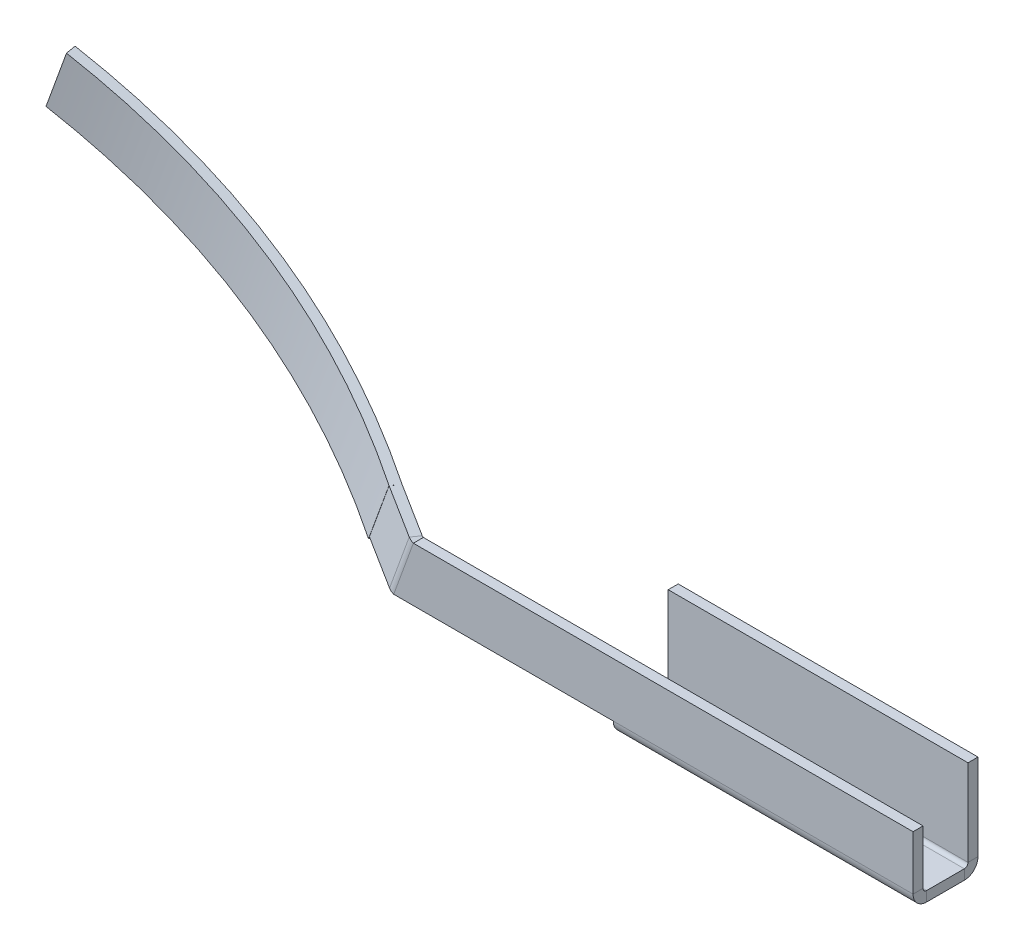
ISO-10303-21;
HEADER;
FILE_DESCRIPTION(('STEP AP214'),'2;1');
FILE_NAME('part.step','',(''),(''),'','','');
FILE_SCHEMA(('AUTOMOTIVE_DESIGN { 1 0 10303 214 1 1 1 1 }'));
ENDSEC;
DATA;
#1=APPLICATION_CONTEXT('core data for automotive mechanical design processes');
#2=APPLICATION_PROTOCOL_DEFINITION('international standard','automotive_design',2000,#1);
#3=PRODUCT_CONTEXT('',#1,'mechanical');
#4=PRODUCT('Part','Part','',(#3));
#5=PRODUCT_RELATED_PRODUCT_CATEGORY('part','',(#4));
#6=PRODUCT_DEFINITION_FORMATION('','',#4);
#7=PRODUCT_DEFINITION_CONTEXT('part definition',#1,'design');
#8=PRODUCT_DEFINITION('design','',#6,#7);
#9=PRODUCT_DEFINITION_SHAPE('','',#8);
#10=(LENGTH_UNIT() NAMED_UNIT(*) SI_UNIT(.MILLI.,.METRE.));
#11=(NAMED_UNIT(*) PLANE_ANGLE_UNIT() SI_UNIT($,.RADIAN.));
#12=(NAMED_UNIT(*) SI_UNIT($,.STERADIAN.) SOLID_ANGLE_UNIT());
#13=UNCERTAINTY_MEASURE_WITH_UNIT(LENGTH_MEASURE(1.E-05),#10,'distance_accuracy_value','');
#14=(GEOMETRIC_REPRESENTATION_CONTEXT(3) GLOBAL_UNCERTAINTY_ASSIGNED_CONTEXT((#13)) GLOBAL_UNIT_ASSIGNED_CONTEXT((#10,
#11,#12)) REPRESENTATION_CONTEXT('',''));
#15=CARTESIAN_POINT('',(0.,0.,0.));
#16=DIRECTION('',(0.,0.,1.));
#17=DIRECTION('',(1.,0.,0.));
#18=AXIS2_PLACEMENT_3D('',#15,#16,#17);
#19=CARTESIAN_POINT('',(30.,-10.,0.));
#20=DIRECTION('',(1.,0.,0.));
#21=DIRECTION('',(0.,0.,-1.));
#22=AXIS2_PLACEMENT_3D('',#19,#20,#21);
#23=PLANE('',#22);
#24=DIRECTION('',(0.,0.,1.));
#25=VECTOR('',#24,1.);
#26=CARTESIAN_POINT('',(30.,-8.,0.));
#27=LINE('',#26,#25);
#28=CARTESIAN_POINT('',(30.,-8.00000000000002,8.26340000000001));
#29=VERTEX_POINT('',#28);
#30=CARTESIAN_POINT('',(30.,-8.,0.736599999999997));
#31=VERTEX_POINT('',#30);
#32=EDGE_CURVE('E609',#29,#31,#27,.F.);
#33=ORIENTED_EDGE('',*,*,#32,.F.);
#34=DIRECTION('',(0.,-1.,0.));
#35=VECTOR('',#34,1.);
#36=CARTESIAN_POINT('',(30.,-8.00000000000002,8.26340000000001));
#37=LINE('',#36,#35);
#38=CARTESIAN_POINT('',(30.,-10.,8.26340000000017));
#39=VERTEX_POINT('',#38);
#40=EDGE_CURVE('E572',#29,#39,#37,.T.);
#41=ORIENTED_EDGE('',*,*,#40,.T.);
#42=DIRECTION('',(0.,0.,-1.));
#43=VECTOR('',#42,1.);
#44=CARTESIAN_POINT('',(30.,-10.,0.));
#45=LINE('',#44,#43);
#46=CARTESIAN_POINT('',(30.,-10.,0.73659999999999));
#47=VERTEX_POINT('',#46);
#48=EDGE_CURVE('E601',#39,#47,#45,.T.);
#49=ORIENTED_EDGE('',*,*,#48,.T.);
#50=DIRECTION('',(0.,-1.,0.));
#51=VECTOR('',#50,1.);
#52=CARTESIAN_POINT('',(30.,-8.,0.736599999999997));
#53=LINE('',#52,#51);
#54=EDGE_CURVE('E620',#31,#47,#53,.T.);
#55=ORIENTED_EDGE('',*,*,#54,.F.);
#56=EDGE_LOOP('',(#33,#41,#49,#55));
#57=FACE_BOUND('',#56,.T.);
#58=ADVANCED_FACE('F101',(#57),#23,.T.);
#59=CARTESIAN_POINT('',(0.,-10.,0.));
#60=DIRECTION('',(0.,-1.,0.));
#61=DIRECTION('',(0.,0.,-1.));
#62=AXIS2_PLACEMENT_3D('',#59,#60,#61);
#63=PLANE('',#62);
#64=ORIENTED_EDGE('',*,*,#48,.F.);
#65=DIRECTION('',(1.,0.,0.));
#66=VECTOR('',#65,1.);
#67=CARTESIAN_POINT('',(30.,-10.,8.26340000000017));
#68=LINE('',#67,#66);
#69=CARTESIAN_POINT('',(-30.,-10.,8.26340000000007));
#70=VERTEX_POINT('',#69);
#71=EDGE_CURVE('E564',#39,#70,#68,.F.);
#72=ORIENTED_EDGE('',*,*,#71,.T.);
#73=DIRECTION('',(0.,0.,1.));
#74=VECTOR('',#73,1.);
#75=CARTESIAN_POINT('',(-30.,-10.,11.));
#76=LINE('',#75,#74);
#77=CARTESIAN_POINT('',(-30.,-10.,0.73659999999999));
#78=VERTEX_POINT('',#77);
#79=EDGE_CURVE('E605',#78,#70,#76,.T.);
#80=ORIENTED_EDGE('',*,*,#79,.F.);
#81=DIRECTION('',(1.,0.,0.));
#82=VECTOR('',#81,1.);
#83=CARTESIAN_POINT('',(0.,-10.,0.73659999999999));
#84=LINE('',#83,#82);
#85=EDGE_CURVE('E616',#78,#47,#84,.T.);
#86=ORIENTED_EDGE('',*,*,#85,.T.);
#87=EDGE_LOOP('',(#64,#72,#80,#86));
#88=FACE_BOUND('',#87,.T.);
#89=ADVANCED_FACE('F370',(#88),#63,.T.);
#90=CARTESIAN_POINT('',(0.,-8.,0.));
#91=DIRECTION('',(0.,-1.,0.));
#92=DIRECTION('',(0.,0.,-1.));
#93=AXIS2_PLACEMENT_3D('',#90,#91,#92);
#94=PLANE('',#93);
#95=DIRECTION('',(1.,0.,0.));
#96=VECTOR('',#95,1.);
#97=CARTESIAN_POINT('',(30.,-8.00000000000002,8.26340000000001));
#98=LINE('',#97,#96);
#99=CARTESIAN_POINT('',(-30.,-8.00000000000002,8.26340000000008));
#100=VERTEX_POINT('',#99);
#101=EDGE_CURVE('E580',#29,#100,#98,.F.);
#102=ORIENTED_EDGE('',*,*,#101,.F.);
#103=ORIENTED_EDGE('',*,*,#32,.T.);
#104=DIRECTION('',(-1.,0.,0.));
#105=VECTOR('',#104,1.);
#106=CARTESIAN_POINT('',(-30.,-8.,0.736599999999997));
#107=LINE('',#106,#105);
#108=CARTESIAN_POINT('',(-30.,-8.,0.736599999999997));
#109=VERTEX_POINT('',#108);
#110=EDGE_CURVE('E624',#109,#31,#107,.F.);
#111=ORIENTED_EDGE('',*,*,#110,.F.);
#112=DIRECTION('',(0.,0.,-1.));
#113=VECTOR('',#112,1.);
#114=CARTESIAN_POINT('',(-30.,-8.,0.));
#115=LINE('',#114,#113);
#116=EDGE_CURVE('E612',#109,#100,#115,.F.);
#117=ORIENTED_EDGE('',*,*,#116,.T.);
#118=EDGE_LOOP('',(#102,#103,#111,#117));
#119=FACE_BOUND('',#118,.T.);
#120=ADVANCED_FACE('F373',(#119),#94,.F.);
#121=CARTESIAN_POINT('',(30.,10.,-2.));
#122=DIRECTION('',(1.,0.,0.));
#123=DIRECTION('',(0.,1.,0.));
#124=AXIS2_PLACEMENT_3D('',#121,#122,#123);
#125=PLANE('',#124);
#126=DIRECTION('',(0.,1.,0.));
#127=VECTOR('',#126,1.);
#128=CARTESIAN_POINT('',(30.,10.,0.));
#129=LINE('',#128,#127);
#130=CARTESIAN_POINT('',(30.,-7.2634,0.));
#131=VERTEX_POINT('',#130);
#132=CARTESIAN_POINT('',(30.,10.,0.));
#133=VERTEX_POINT('',#132);
#134=EDGE_CURVE('E429',#131,#133,#129,.T.);
#135=ORIENTED_EDGE('',*,*,#134,.F.);
#136=DIRECTION('',(0.,0.,-1.));
#137=VECTOR('',#136,1.);
#138=CARTESIAN_POINT('',(30.,-7.2634,0.));
#139=LINE('',#138,#137);
#140=CARTESIAN_POINT('',(30.,-7.2634,-2.));
#141=VERTEX_POINT('',#140);
#142=EDGE_CURVE('E639',#131,#141,#139,.T.);
#143=ORIENTED_EDGE('',*,*,#142,.T.);
#144=DIRECTION('',(0.,1.,0.));
#145=VECTOR('',#144,1.);
#146=CARTESIAN_POINT('',(30.,10.,-2.));
#147=LINE('',#146,#145);
#148=CARTESIAN_POINT('',(30.,10.,-2.));
#149=VERTEX_POINT('',#148);
#150=EDGE_CURVE('E433',#141,#149,#147,.T.);
#151=ORIENTED_EDGE('',*,*,#150,.T.);
#152=DIRECTION('',(0.,0.,1.));
#153=VECTOR('',#152,1.);
#154=CARTESIAN_POINT('',(30.,10.,-2.));
#155=LINE('',#154,#153);
#156=EDGE_CURVE('E422',#149,#133,#155,.T.);
#157=ORIENTED_EDGE('',*,*,#156,.T.);
#158=EDGE_LOOP('',(#135,#143,#151,#157));
#159=FACE_BOUND('',#158,.T.);
#160=ADVANCED_FACE('F103',(#159),#125,.T.);
#161=CARTESIAN_POINT('',(0.,0.,-2.));
#162=DIRECTION('',(0.,0.,1.));
#163=DIRECTION('',(1.,0.,0.));
#164=AXIS2_PLACEMENT_3D('',#161,#162,#163);
#165=PLANE('',#164);
#166=DIRECTION('',(1.,0.,0.));
#167=VECTOR('',#166,1.);
#168=CARTESIAN_POINT('',(30.,-7.2634,-2.));
#169=LINE('',#168,#167);
#170=CARTESIAN_POINT('',(-30.,-7.26339999999999,-2.));
#171=VERTEX_POINT('',#170);
#172=EDGE_CURVE('E631',#141,#171,#169,.F.);
#173=ORIENTED_EDGE('',*,*,#172,.T.);
#174=DIRECTION('',(0.,-1.,0.));
#175=VECTOR('',#174,1.);
#176=CARTESIAN_POINT('',(-30.,10.,-2.));
#177=LINE('',#176,#175);
#178=CARTESIAN_POINT('',(-30.,10.,-2.));
#179=VERTEX_POINT('',#178);
#180=EDGE_CURVE('E442',#179,#171,#177,.T.);
#181=ORIENTED_EDGE('',*,*,#180,.F.);
#182=DIRECTION('',(-1.,0.,0.));
#183=VECTOR('',#182,1.);
#184=CARTESIAN_POINT('',(-30.,10.,-2.));
#185=LINE('',#184,#183);
#186=EDGE_CURVE('E662',#149,#179,#185,.T.);
#187=ORIENTED_EDGE('',*,*,#186,.F.);
#188=ORIENTED_EDGE('',*,*,#150,.F.);
#189=EDGE_LOOP('',(#173,#181,#187,#188));
#190=FACE_BOUND('',#189,.T.);
#191=ADVANCED_FACE('F401',(#190),#165,.F.);
#192=CARTESIAN_POINT('',(0.,0.,0.));
#193=DIRECTION('',(0.,0.,1.));
#194=DIRECTION('',(1.,0.,0.));
#195=AXIS2_PLACEMENT_3D('',#192,#193,#194);
#196=PLANE('',#195);
#197=DIRECTION('',(0.,-1.,0.));
#198=VECTOR('',#197,1.);
#199=CARTESIAN_POINT('',(-30.,10.,0.));
#200=LINE('',#199,#198);
#201=CARTESIAN_POINT('',(-30.,10.,0.));
#202=VERTEX_POINT('',#201);
#203=CARTESIAN_POINT('',(-30.,-7.2634,0.));
#204=VERTEX_POINT('',#203);
#205=EDGE_CURVE('E428',#202,#204,#200,.T.);
#206=ORIENTED_EDGE('',*,*,#205,.T.);
#207=DIRECTION('',(1.,0.,0.));
#208=VECTOR('',#207,1.);
#209=CARTESIAN_POINT('',(30.,-7.2634,0.));
#210=LINE('',#209,#208);
#211=EDGE_CURVE('E647',#131,#204,#210,.F.);
#212=ORIENTED_EDGE('',*,*,#211,.F.);
#213=ORIENTED_EDGE('',*,*,#134,.T.);
#214=DIRECTION('',(-1.,0.,0.));
#215=VECTOR('',#214,1.);
#216=CARTESIAN_POINT('',(-30.,10.,0.));
#217=LINE('',#216,#215);
#218=EDGE_CURVE('E419',#133,#202,#217,.T.);
#219=ORIENTED_EDGE('',*,*,#218,.T.);
#220=EDGE_LOOP('',(#206,#212,#213,#219));
#221=FACE_BOUND('',#220,.T.);
#222=ADVANCED_FACE('F404',(#221),#196,.T.);
#223=CARTESIAN_POINT('',(-30.,10.,-2.));
#224=DIRECTION('',(-1.,0.,0.));
#225=DIRECTION('',(0.,-1.,0.));
#226=AXIS2_PLACEMENT_3D('',#223,#224,#225);
#227=PLANE('',#226);
#228=DIRECTION('',(0.,0.,-1.));
#229=VECTOR('',#228,1.);
#230=CARTESIAN_POINT('',(-30.,-7.2634,0.));
#231=LINE('',#230,#229);
#232=EDGE_CURVE('E435',#204,#171,#231,.T.);
#233=ORIENTED_EDGE('',*,*,#232,.F.);
#234=ORIENTED_EDGE('',*,*,#205,.F.);
#235=DIRECTION('',(0.,0.,1.));
#236=VECTOR('',#235,1.);
#237=CARTESIAN_POINT('',(-30.,10.,-2.));
#238=LINE('',#237,#236);
#239=EDGE_CURVE('E424',#179,#202,#238,.T.);
#240=ORIENTED_EDGE('',*,*,#239,.F.);
#241=ORIENTED_EDGE('',*,*,#180,.T.);
#242=EDGE_LOOP('',(#233,#234,#240,#241));
#243=FACE_BOUND('',#242,.T.);
#244=ADVANCED_FACE('F408',(#243),#227,.T.);
#245=CARTESIAN_POINT('',(-30.,10.,-2.));
#246=DIRECTION('',(0.,1.,0.));
#247=DIRECTION('',(0.,0.,1.));
#248=AXIS2_PLACEMENT_3D('',#245,#246,#247);
#249=PLANE('',#248);
#250=ORIENTED_EDGE('',*,*,#218,.F.);
#251=ORIENTED_EDGE('',*,*,#156,.F.);
#252=ORIENTED_EDGE('',*,*,#186,.T.);
#253=ORIENTED_EDGE('',*,*,#239,.T.);
#254=EDGE_LOOP('',(#250,#251,#252,#253));
#255=FACE_BOUND('',#254,.T.);
#256=ADVANCED_FACE('F396',(#255),#249,.T.);
#257=CARTESIAN_POINT('',(-30.,-7.2634,0.7366));
#258=DIRECTION('',(-1.,0.,0.));
#259=DIRECTION('',(0.,0.,1.));
#260=AXIS2_PLACEMENT_3D('',#257,#258,#259);
#261=PLANE('',#260);
#262=DIRECTION('',(0.,-1.,0.));
#263=VECTOR('',#262,1.);
#264=CARTESIAN_POINT('',(-30.,-10.,0.73659999999999));
#265=LINE('',#264,#263);
#266=EDGE_CURVE('E597',#109,#78,#265,.T.);
#267=ORIENTED_EDGE('',*,*,#266,.F.);
#268=CARTESIAN_POINT('',(-30.,-7.2634,0.7366));
#269=DIRECTION('',(1.,0.,0.));
#270=DIRECTION('',(0.,0.,-1.));
#271=AXIS2_PLACEMENT_3D('',#268,#269,#270);
#272=CIRCLE('',#271,0.7366);
#273=EDGE_CURVE('E643',#204,#109,#272,.F.);
#274=ORIENTED_EDGE('',*,*,#273,.F.);
#275=ORIENTED_EDGE('',*,*,#232,.T.);
#276=CARTESIAN_POINT('',(-30.,-7.2634,0.7366));
#277=DIRECTION('',(1.,0.,0.));
#278=DIRECTION('',(0.,0.,-1.));
#279=AXIS2_PLACEMENT_3D('',#276,#277,#278);
#280=CIRCLE('',#279,2.7366);
#281=EDGE_CURVE('E634',#171,#78,#280,.F.);
#282=ORIENTED_EDGE('',*,*,#281,.T.);
#283=EDGE_LOOP('',(#267,#274,#275,#282));
#284=FACE_BOUND('',#283,.T.);
#285=ADVANCED_FACE('F393',(#284),#261,.T.);
#286=CARTESIAN_POINT('',(30.,-7.2634,0.7366));
#287=DIRECTION('',(-1.,0.,0.));
#288=DIRECTION('',(0.,0.,1.));
#289=AXIS2_PLACEMENT_3D('',#286,#287,#288);
#290=PLANE('',#289);
#291=CARTESIAN_POINT('',(30.,-7.2634,0.7366));
#292=DIRECTION('',(1.,0.,0.));
#293=DIRECTION('',(0.,0.,-1.));
#294=AXIS2_PLACEMENT_3D('',#291,#292,#293);
#295=CIRCLE('',#294,0.7366);
#296=EDGE_CURVE('E604',#31,#131,#295,.T.);
#297=ORIENTED_EDGE('',*,*,#296,.F.);
#298=ORIENTED_EDGE('',*,*,#54,.T.);
#299=CARTESIAN_POINT('',(30.,-7.2634,0.7366));
#300=DIRECTION('',(1.,0.,0.));
#301=DIRECTION('',(0.,0.,-1.));
#302=AXIS2_PLACEMENT_3D('',#299,#300,#301);
#303=CIRCLE('',#302,2.7366);
#304=EDGE_CURVE('E635',#47,#141,#303,.T.);
#305=ORIENTED_EDGE('',*,*,#304,.T.);
#306=ORIENTED_EDGE('',*,*,#142,.F.);
#307=EDGE_LOOP('',(#297,#298,#305,#306));
#308=FACE_BOUND('',#307,.T.);
#309=ADVANCED_FACE('F388',(#308),#290,.F.);
#310=CARTESIAN_POINT('',(30.,-7.2634,0.7366));
#311=DIRECTION('',(1.,0.,0.));
#312=DIRECTION('',(0.,-1.,0.));
#313=AXIS2_PLACEMENT_3D('',#310,#311,#312);
#314=CYLINDRICAL_SURFACE('',#313,2.7366);
#315=ORIENTED_EDGE('',*,*,#172,.F.);
#316=ORIENTED_EDGE('',*,*,#304,.F.);
#317=ORIENTED_EDGE('',*,*,#85,.F.);
#318=ORIENTED_EDGE('',*,*,#281,.F.);
#319=EDGE_LOOP('',(#315,#316,#317,#318));
#320=FACE_BOUND('',#319,.T.);
#321=ADVANCED_FACE('F385',(#320),#314,.T.);
#322=CARTESIAN_POINT('',(30.,-7.2634,0.7366));
#323=DIRECTION('',(1.,0.,0.));
#324=DIRECTION('',(0.,-1.,0.));
#325=AXIS2_PLACEMENT_3D('',#322,#323,#324);
#326=CYLINDRICAL_SURFACE('',#325,0.7366);
#327=ORIENTED_EDGE('',*,*,#211,.T.);
#328=ORIENTED_EDGE('',*,*,#273,.T.);
#329=ORIENTED_EDGE('',*,*,#110,.T.);
#330=ORIENTED_EDGE('',*,*,#296,.T.);
#331=EDGE_LOOP('',(#327,#328,#329,#330));
#332=FACE_BOUND('',#331,.T.);
#333=ADVANCED_FACE('F383',(#332),#326,.F.);
#334=CARTESIAN_POINT('',(-30.,-10.,11.));
#335=DIRECTION('',(-1.,0.,0.));
#336=DIRECTION('',(0.,0.,1.));
#337=AXIS2_PLACEMENT_3D('',#334,#335,#336);
#338=PLANE('',#337);
#339=DIRECTION('',(0.,-1.,0.));
#340=VECTOR('',#339,1.);
#341=CARTESIAN_POINT('',(-30.,-8.00000000000002,8.26340000000008));
#342=LINE('',#341,#340);
#343=EDGE_CURVE('E589',#100,#70,#342,.T.);
#344=ORIENTED_EDGE('',*,*,#343,.F.);
#345=ORIENTED_EDGE('',*,*,#116,.F.);
#346=ORIENTED_EDGE('',*,*,#266,.T.);
#347=ORIENTED_EDGE('',*,*,#79,.T.);
#348=EDGE_LOOP('',(#344,#345,#346,#347));
#349=FACE_BOUND('',#348,.T.);
#350=ADVANCED_FACE('F365',(#349),#338,.T.);
#351=CARTESIAN_POINT('',(-30.,-7.26340000000003,8.26340000000002));
#352=DIRECTION('',(-1.,0.,0.));
#353=DIRECTION('',(0.,0.,1.));
#354=AXIS2_PLACEMENT_3D('',#351,#352,#353);
#355=PLANE('',#354);
#356=DIRECTION('',(0.,0.,1.));
#357=VECTOR('',#356,1.);
#358=CARTESIAN_POINT('',(-30.,-7.26340000000003,9.00000000000001));
#359=LINE('',#358,#357);
#360=CARTESIAN_POINT('',(-30.,-7.26340000000003,9.00000000000001));
#361=VERTEX_POINT('',#360);
#362=CARTESIAN_POINT('',(-30.,-7.26340000000002,11.));
#363=VERTEX_POINT('',#362);
#364=EDGE_CURVE('E593',#361,#363,#359,.T.);
#365=ORIENTED_EDGE('',*,*,#364,.F.);
#366=CARTESIAN_POINT('',(-30.,-7.26340000000003,8.26340000000002));
#367=DIRECTION('',(1.,0.,0.));
#368=DIRECTION('',(0.,0.,-1.));
#369=AXIS2_PLACEMENT_3D('',#366,#367,#368);
#370=CIRCLE('',#369,0.73659999999999);
#371=EDGE_CURVE('E576',#100,#361,#370,.F.);
#372=ORIENTED_EDGE('',*,*,#371,.F.);
#373=ORIENTED_EDGE('',*,*,#343,.T.);
#374=CARTESIAN_POINT('',(-30.,-7.26340000000003,8.26340000000002));
#375=DIRECTION('',(1.,0.,0.));
#376=DIRECTION('',(0.,0.,-1.));
#377=AXIS2_PLACEMENT_3D('',#374,#375,#376);
#378=CIRCLE('',#377,2.73659999999999);
#379=EDGE_CURVE('E568',#70,#363,#378,.F.);
#380=ORIENTED_EDGE('',*,*,#379,.T.);
#381=EDGE_LOOP('',(#365,#372,#373,#380));
#382=FACE_BOUND('',#381,.T.);
#383=ADVANCED_FACE('F362',(#382),#355,.T.);
#384=CARTESIAN_POINT('',(30.,-7.26340000000003,8.26339999999995));
#385=DIRECTION('',(-1.,0.,0.));
#386=DIRECTION('',(0.,0.,1.));
#387=AXIS2_PLACEMENT_3D('',#384,#385,#386);
#388=PLANE('',#387);
#389=CARTESIAN_POINT('',(30.,-7.26340000000003,8.26339999999995));
#390=DIRECTION('',(1.,0.,0.));
#391=DIRECTION('',(0.,0.,-1.));
#392=AXIS2_PLACEMENT_3D('',#389,#390,#391);
#393=CIRCLE('',#392,0.73659999999999);
#394=CARTESIAN_POINT('',(30.,-7.26340000000003,8.99999999999994));
#395=VERTEX_POINT('',#394);
#396=EDGE_CURVE('E583',#395,#29,#393,.T.);
#397=ORIENTED_EDGE('',*,*,#396,.F.);
#398=DIRECTION('',(0.,0.,1.));
#399=VECTOR('',#398,1.);
#400=CARTESIAN_POINT('',(30.,-7.26340000000003,9.00000000000001));
#401=LINE('',#400,#399);
#402=CARTESIAN_POINT('',(30.,-7.26340000000005,10.9999999999999));
#403=VERTEX_POINT('',#402);
#404=EDGE_CURVE('E554',#395,#403,#401,.T.);
#405=ORIENTED_EDGE('',*,*,#404,.T.);
#406=CARTESIAN_POINT('',(30.,-7.26340000000003,8.26339999999995));
#407=DIRECTION('',(1.,0.,0.));
#408=DIRECTION('',(0.,0.,-1.));
#409=AXIS2_PLACEMENT_3D('',#406,#407,#408);
#410=CIRCLE('',#409,2.73659999999999);
#411=EDGE_CURVE('E569',#403,#39,#410,.T.);
#412=ORIENTED_EDGE('',*,*,#411,.T.);
#413=ORIENTED_EDGE('',*,*,#40,.F.);
#414=EDGE_LOOP('',(#397,#405,#412,#413));
#415=FACE_BOUND('',#414,.T.);
#416=ADVANCED_FACE('F357',(#415),#388,.F.);
#417=CARTESIAN_POINT('',(30.,-7.26340000000003,8.26339999999995));
#418=DIRECTION('',(1.,0.,0.));
#419=DIRECTION('',(0.,0.,1.));
#420=AXIS2_PLACEMENT_3D('',#417,#418,#419);
#421=CYLINDRICAL_SURFACE('',#420,2.73659999999999);
#422=ORIENTED_EDGE('',*,*,#71,.F.);
#423=ORIENTED_EDGE('',*,*,#411,.F.);
#424=DIRECTION('',(1.,0.,0.));
#425=VECTOR('',#424,1.);
#426=CARTESIAN_POINT('',(-73.9383007458443,-7.26340000000002,11.));
#427=LINE('',#426,#425);
#428=EDGE_CURVE('E549',#403,#363,#427,.F.);
#429=ORIENTED_EDGE('',*,*,#428,.T.);
#430=ORIENTED_EDGE('',*,*,#379,.F.);
#431=EDGE_LOOP('',(#422,#423,#429,#430));
#432=FACE_BOUND('',#431,.T.);
#433=ADVANCED_FACE('F354',(#432),#421,.T.);
#434=CARTESIAN_POINT('',(30.,-7.26340000000003,8.26339999999995));
#435=DIRECTION('',(1.,0.,0.));
#436=DIRECTION('',(0.,0.,1.));
#437=AXIS2_PLACEMENT_3D('',#434,#435,#436);
#438=CYLINDRICAL_SURFACE('',#437,0.73659999999999);
#439=ORIENTED_EDGE('',*,*,#101,.T.);
#440=ORIENTED_EDGE('',*,*,#371,.T.);
#441=DIRECTION('',(1.,0.,0.));
#442=VECTOR('',#441,1.);
#443=CARTESIAN_POINT('',(30.,-7.26340000000003,8.99999999999994));
#444=LINE('',#443,#442);
#445=EDGE_CURVE('E521',#361,#395,#444,.T.);
#446=ORIENTED_EDGE('',*,*,#445,.T.);
#447=ORIENTED_EDGE('',*,*,#396,.T.);
#448=EDGE_LOOP('',(#439,#440,#446,#447));
#449=FACE_BOUND('',#448,.T.);
#450=ADVANCED_FACE('F349',(#449),#438,.F.);
#451=CARTESIAN_POINT('',(30.,3.55699237022819,11.0000000000001));
#452=DIRECTION('',(1.,0.,0.));
#453=DIRECTION('',(0.,1.,0.));
#454=AXIS2_PLACEMENT_3D('',#451,#452,#453);
#455=PLANE('',#454);
#456=DIRECTION('',(0.,1.,0.));
#457=VECTOR('',#456,1.);
#458=CARTESIAN_POINT('',(30.,3.55699237022819,11.0000000000001));
#459=LINE('',#458,#457);
#460=CARTESIAN_POINT('',(30.,3.55699237022819,11.0000000000001));
#461=VERTEX_POINT('',#460);
#462=EDGE_CURVE('E526',#461,#403,#459,.F.);
#463=ORIENTED_EDGE('',*,*,#462,.T.);
#464=ORIENTED_EDGE('',*,*,#404,.F.);
#465=DIRECTION('',(0.,-1.,0.));
#466=VECTOR('',#465,1.);
#467=CARTESIAN_POINT('',(30.,0.,9.00000000000006));
#468=LINE('',#467,#466);
#469=CARTESIAN_POINT('',(30.,3.5569923702282,9.00000000000009));
#470=VERTEX_POINT('',#469);
#471=EDGE_CURVE('E538',#470,#395,#468,.T.);
#472=ORIENTED_EDGE('',*,*,#471,.F.);
#473=DIRECTION('',(0.,0.,-1.));
#474=VECTOR('',#473,1.);
#475=CARTESIAN_POINT('',(30.,3.55699237022819,11.0000000000001));
#476=LINE('',#475,#474);
#477=EDGE_CURVE('E518',#461,#470,#476,.T.);
#478=ORIENTED_EDGE('',*,*,#477,.F.);
#479=EDGE_LOOP('',(#463,#464,#472,#478));
#480=FACE_BOUND('',#479,.T.);
#481=ADVANCED_FACE('F342',(#480),#455,.T.);
#482=CARTESIAN_POINT('',(0.,0.,11.0000000000001));
#483=DIRECTION('',(0.,0.,-1.));
#484=DIRECTION('',(0.,1.,0.));
#485=AXIS2_PLACEMENT_3D('',#482,#483,#484);
#486=PLANE('',#485);
#487=ORIENTED_EDGE('',*,*,#428,.F.);
#488=ORIENTED_EDGE('',*,*,#462,.F.);
#489=DIRECTION('',(-1.,0.,0.));
#490=VECTOR('',#489,1.);
#491=CARTESIAN_POINT('',(30.,3.55699237022819,11.0000000000001));
#492=LINE('',#491,#490);
#493=CARTESIAN_POINT('',(-70.,3.55699237022819,11.));
#494=VERTEX_POINT('',#493);
#495=EDGE_CURVE('E530',#494,#461,#492,.F.);
#496=ORIENTED_EDGE('',*,*,#495,.F.);
#497=DIRECTION('',(-0.342020143325674,-0.939692620785907,0.));
#498=VECTOR('',#497,1.);
#499=CARTESIAN_POINT('',(-70.,3.55699237022819,11.0000000000001));
#500=LINE('',#499,#498);
#501=CARTESIAN_POINT('',(-73.9383007458443,-7.26340000000002,11.));
#502=VERTEX_POINT('',#501);
#503=EDGE_CURVE('E534',#502,#494,#500,.F.);
#504=ORIENTED_EDGE('',*,*,#503,.F.);
#505=EDGE_CURVE('E553',#363,#502,#427,.F.);
#506=ORIENTED_EDGE('',*,*,#505,.F.);
#507=EDGE_LOOP('',(#487,#488,#496,#504,#506));
#508=FACE_BOUND('',#507,.T.);
#509=ADVANCED_FACE('F338',(#508),#486,.F.);
#510=CARTESIAN_POINT('',(0.,0.,9.00000000000006));
#511=DIRECTION('',(0.,0.,-1.));
#512=DIRECTION('',(0.,1.,0.));
#513=AXIS2_PLACEMENT_3D('',#510,#511,#512);
#514=PLANE('',#513);
#515=ORIENTED_EDGE('',*,*,#471,.T.);
#516=ORIENTED_EDGE('',*,*,#445,.F.);
#517=DIRECTION('',(1.,0.,0.));
#518=VECTOR('',#517,1.);
#519=CARTESIAN_POINT('',(-73.9383007458443,-7.26340000000002,9.00000000000001));
#520=LINE('',#519,#518);
#521=CARTESIAN_POINT('',(-73.9383007458443,-7.26340000000002,9.00000000000001));
#522=VERTEX_POINT('',#521);
#523=EDGE_CURVE('E557',#522,#361,#520,.T.);
#524=ORIENTED_EDGE('',*,*,#523,.F.);
#525=DIRECTION('',(0.342020143325674,0.939692620785907,0.));
#526=VECTOR('',#525,1.);
#527=CARTESIAN_POINT('',(-62.9547508208302,22.9136554044283,9.00000000000022));
#528=LINE('',#527,#526);
#529=CARTESIAN_POINT('',(-70.,3.5569923702282,9.00000000000009));
#530=VERTEX_POINT('',#529);
#531=EDGE_CURVE('E546',#522,#530,#528,.T.);
#532=ORIENTED_EDGE('',*,*,#531,.T.);
#533=DIRECTION('',(1.,0.,0.));
#534=VECTOR('',#533,1.);
#535=CARTESIAN_POINT('',(0.,3.5569923702282,9.00000000000009));
#536=LINE('',#535,#534);
#537=EDGE_CURVE('E542',#530,#470,#536,.T.);
#538=ORIENTED_EDGE('',*,*,#537,.T.);
#539=EDGE_LOOP('',(#515,#516,#524,#532,#538));
#540=FACE_BOUND('',#539,.T.);
#541=ADVANCED_FACE('F341',(#540),#514,.T.);
#542=CARTESIAN_POINT('',(30.,3.55699237022819,11.0000000000001));
#543=DIRECTION('',(0.,1.,0.));
#544=DIRECTION('',(0.,0.,1.));
#545=AXIS2_PLACEMENT_3D('',#542,#543,#544);
#546=PLANE('',#545);
#547=ORIENTED_EDGE('',*,*,#537,.F.);
#548=DIRECTION('',(0.,0.,-1.));
#549=VECTOR('',#548,1.);
#550=CARTESIAN_POINT('',(-70.,3.55699237022819,11.0000000000001));
#551=LINE('',#550,#549);
#552=EDGE_CURVE('E522',#494,#530,#551,.T.);
#553=ORIENTED_EDGE('',*,*,#552,.F.);
#554=ORIENTED_EDGE('',*,*,#495,.T.);
#555=ORIENTED_EDGE('',*,*,#477,.T.);
#556=EDGE_LOOP('',(#547,#553,#554,#555));
#557=FACE_BOUND('',#556,.T.);
#558=ADVANCED_FACE('F336',(#557),#546,.T.);
#559=CARTESIAN_POINT('',(-73.9383007458443,-7.26340000000002,9.00000000000001));
#560=DIRECTION('',(0.,-1.,0.));
#561=DIRECTION('',(1.,0.,0.));
#562=AXIS2_PLACEMENT_3D('',#559,#560,#561);
#563=PLANE('',#562);
#564=ORIENTED_EDGE('',*,*,#523,.T.);
#565=ORIENTED_EDGE('',*,*,#364,.T.);
#566=ORIENTED_EDGE('',*,*,#505,.T.);
#567=DIRECTION('',(0.,0.,1.));
#568=VECTOR('',#567,1.);
#569=CARTESIAN_POINT('',(-73.9383007458443,-7.26340000000002,11.0000000000001));
#570=LINE('',#569,#568);
#571=EDGE_CURVE('E506',#522,#502,#570,.T.);
#572=ORIENTED_EDGE('',*,*,#571,.F.);
#573=EDGE_LOOP('',(#564,#565,#566,#572));
#574=FACE_BOUND('',#573,.T.);
#575=ADVANCED_FACE('F329',(#574),#563,.T.);
#576=CARTESIAN_POINT('',(-73.9383007458442,-7.26340000000003,8.26340000000006));
#577=DIRECTION('',(-0.342020143325672,-0.939692620785907,0.));
#578=DIRECTION('',(0.939692620785907,-0.342020143325672,0.));
#579=AXIS2_PLACEMENT_3D('',#576,#577,#578);
#580=PLANE('',#579);
#581=DIRECTION('',(0.397131261967097,-0.144543958452593,-0.906307787036653));
#582=VECTOR('',#581,1.);
#583=CARTESIAN_POINT('',(-75.0250901573434,-6.86784100329866,10.7436018900045));
#584=LINE('',#583,#582);
#585=CARTESIAN_POINT('',(-74.2308276334092,-7.15692892020385,8.93098631593123));
#586=VERTEX_POINT('',#585);
#587=CARTESIAN_POINT('',(-75.0250901573434,-6.86784100329865,10.7436018900045));
#588=VERTEX_POINT('',#587);
#589=EDGE_CURVE('E461',#586,#588,#584,.F.);
#590=ORIENTED_EDGE('',*,*,#589,.F.);
#591=CARTESIAN_POINT('',(-73.9383007458442,-7.26340000000003,8.26340000000006));
#592=DIRECTION('',(0.342020143325672,0.939692620785907,0.));
#593=DIRECTION('',(-0.939692620785907,0.342020143325672,0.));
#594=AXIS2_PLACEMENT_3D('',#591,#592,#593);
#595=CIRCLE('',#594,0.73659999999996);
#596=EDGE_CURVE('E511',#522,#586,#595,.F.);
#597=ORIENTED_EDGE('',*,*,#596,.F.);
#598=ORIENTED_EDGE('',*,*,#571,.T.);
#599=CARTESIAN_POINT('',(-73.9383007458442,-7.26340000000002,8.26340000000006));
#600=DIRECTION('',(0.342020143325672,0.939692620785907,0.));
#601=DIRECTION('',(-0.939692620785907,0.342020143325672,0.));
#602=AXIS2_PLACEMENT_3D('',#599,#600,#601);
#603=CIRCLE('',#602,2.73659999999996);
#604=EDGE_CURVE('E502',#502,#588,#603,.F.);
#605=ORIENTED_EDGE('',*,*,#604,.T.);
#606=EDGE_LOOP('',(#590,#597,#598,#605));
#607=FACE_BOUND('',#606,.T.);
#608=ADVANCED_FACE('F326',(#607),#580,.T.);
#609=CARTESIAN_POINT('',(-70.,3.5569923702282,8.26340000000009));
#610=DIRECTION('',(-0.342020143325672,-0.939692620785907,0.));
#611=DIRECTION('',(0.939692620785907,-0.342020143325672,0.));
#612=AXIS2_PLACEMENT_3D('',#609,#610,#611);
#613=PLANE('',#612);
#614=CARTESIAN_POINT('',(-70.,3.5569923702282,8.26340000000009));
#615=DIRECTION('',(0.342020143325672,0.939692620785907,0.));
#616=DIRECTION('',(-0.939692620785907,0.342020143325672,0.));
#617=AXIS2_PLACEMENT_3D('',#614,#615,#616);
#618=CIRCLE('',#617,0.73659999999996);
#619=CARTESIAN_POINT('',(-70.292526887565,3.66346345002438,8.93098631593125));
#620=VERTEX_POINT('',#619);
#621=EDGE_CURVE('E473',#620,#530,#618,.T.);
#622=ORIENTED_EDGE('',*,*,#621,.F.);
#623=DIRECTION('',(0.397131261967097,-0.144543958452593,-0.906307787036653));
#624=VECTOR('',#623,1.);
#625=CARTESIAN_POINT('',(-70.292526887565,3.66346345002438,8.93098631593129));
#626=LINE('',#625,#624);
#627=CARTESIAN_POINT('',(-71.0867894114992,3.95255136692956,10.7436018900046));
#628=VERTEX_POINT('',#627);
#629=EDGE_CURVE('E493',#620,#628,#626,.F.);
#630=ORIENTED_EDGE('',*,*,#629,.T.);
#631=CARTESIAN_POINT('',(-70.,3.5569923702282,8.26340000000009));
#632=DIRECTION('',(0.342020143325672,0.939692620785907,0.));
#633=DIRECTION('',(-0.939692620785907,0.342020143325672,0.));
#634=AXIS2_PLACEMENT_3D('',#631,#632,#633);
#635=CIRCLE('',#634,2.73659999999996);
#636=EDGE_CURVE('E507',#628,#494,#635,.T.);
#637=ORIENTED_EDGE('',*,*,#636,.T.);
#638=ORIENTED_EDGE('',*,*,#552,.T.);
#639=EDGE_LOOP('',(#622,#630,#637,#638));
#640=FACE_BOUND('',#639,.T.);
#641=ADVANCED_FACE('F321',(#640),#613,.F.);
#642=CARTESIAN_POINT('',(-70.,3.5569923702282,8.26340000000009));
#643=DIRECTION('',(0.342020143325672,0.939692620785907,0.));
#644=DIRECTION('',(-0.397131261967096,0.144543958452596,0.906307787036654));
#645=AXIS2_PLACEMENT_3D('',#642,#643,#644);
#646=CYLINDRICAL_SURFACE('',#645,2.73659999999996);
#647=ORIENTED_EDGE('',*,*,#503,.T.);
#648=ORIENTED_EDGE('',*,*,#636,.F.);
#649=DIRECTION('',(0.342020143325672,0.939692620785907,0.));
#650=VECTOR('',#649,1.);
#651=CARTESIAN_POINT('',(-75.0250901573434,-6.86784100329866,10.7436018900045));
#652=LINE('',#651,#650);
#653=EDGE_CURVE('E490',#628,#588,#652,.F.);
#654=ORIENTED_EDGE('',*,*,#653,.T.);
#655=ORIENTED_EDGE('',*,*,#604,.F.);
#656=EDGE_LOOP('',(#647,#648,#654,#655));
#657=FACE_BOUND('',#656,.T.);
#658=ADVANCED_FACE('F318',(#657),#646,.T.);
#659=CARTESIAN_POINT('',(-70.,3.5569923702282,8.26340000000009));
#660=DIRECTION('',(0.342020143325672,0.939692620785907,0.));
#661=DIRECTION('',(-0.397131261967096,0.144543958452596,0.906307787036654));
#662=AXIS2_PLACEMENT_3D('',#659,#660,#661);
#663=CYLINDRICAL_SURFACE('',#662,0.73659999999996);
#664=ORIENTED_EDGE('',*,*,#531,.F.);
#665=ORIENTED_EDGE('',*,*,#596,.T.);
#666=DIRECTION('',(0.342020143325672,0.939692620785907,0.));
#667=VECTOR('',#666,1.);
#668=CARTESIAN_POINT('',(-74.2308276334092,-7.15692892020385,8.93098631593122));
#669=LINE('',#668,#667);
#670=EDGE_CURVE('E497',#586,#620,#669,.T.);
#671=ORIENTED_EDGE('',*,*,#670,.T.);
#672=ORIENTED_EDGE('',*,*,#621,.T.);
#673=EDGE_LOOP('',(#664,#665,#671,#672));
#674=FACE_BOUND('',#673,.T.);
#675=ADVANCED_FACE('F316',(#674),#663,.F.);
#676=CARTESIAN_POINT('',(-79.0866091495761,6.8642476310849,6.77381738259317));
#677=DIRECTION('',(-0.342020143325673,-0.939692620785907,0.));
#678=DIRECTION('',(0.939692620785907,-0.342020143325673,0.));
#679=AXIS2_PLACEMENT_3D('',#676,#677,#678);
#680=PLANE('',#679);
#681=DIRECTION('',(0.432043961449934,-0.157251141862228,-0.888037214173862));
#682=VECTOR('',#681,1.);
#683=CARTESIAN_POINT('',(-79.121521849059,6.87695481449455,6.75554680973038));
#684=LINE('',#683,#682);
#685=CARTESIAN_POINT('',(-79.121521849059,6.87695481449455,6.75554680973038));
#686=VERTEX_POINT('',#685);
#687=CARTESIAN_POINT('',(-78.6894778876088,6.71970367263224,5.86750959555605));
#688=VERTEX_POINT('',#687);
#689=EDGE_CURVE('E925',#686,#688,#684,.T.);
#690=ORIENTED_EDGE('',*,*,#689,.T.);
#691=DIRECTION('',(0.397131261967097,-0.144543958452593,-0.906307787036653));
#692=VECTOR('',#691,1.);
#693=CARTESIAN_POINT('',(-79.0866091495761,6.86424763108491,6.77381738259317));
#694=LINE('',#693,#692);
#695=CARTESIAN_POINT('',(-79.0866091495761,6.8642476310849,6.77381738259318));
#696=VERTEX_POINT('',#695);
#697=EDGE_CURVE('E450',#696,#688,#694,.T.);
#698=ORIENTED_EDGE('',*,*,#697,.F.);
#699=DIRECTION('',(-0.851650739639148,0.309975519219452,-0.422618261740692));
#700=VECTOR('',#699,1.);
#701=CARTESIAN_POINT('',(-22.4763806870988,-13.7401904842667,34.8657513597687));
#702=LINE('',#701,#700);
#703=EDGE_CURVE('E480',#628,#696,#702,.T.);
#704=ORIENTED_EDGE('',*,*,#703,.F.);
#705=ORIENTED_EDGE('',*,*,#629,.F.);
#706=DIRECTION('',(0.851650739639148,-0.309975519219452,0.422618261740692));
#707=VECTOR('',#706,1.);
#708=CARTESIAN_POINT('',(-78.292346625642,6.57515971417972,4.96120180851986));
#709=LINE('',#708,#707);
#710=CARTESIAN_POINT('',(-78.274767052002,6.56876127264367,4.96992539497154));
#711=VERTEX_POINT('',#710);
#712=EDGE_CURVE('E486',#620,#711,#709,.F.);
#713=ORIENTED_EDGE('',*,*,#712,.T.);
#714=CARTESIAN_POINT('',(-78.2574339261591,6.56245253077009,4.97947238138266));
#715=CARTESIAN_POINT('',(-115.878977407876,20.2555745252671,-15.7456752294451));
#716=CARTESIAN_POINT('',(-157.986975079298,35.5816323022152,-9.27515272953906));
#717=B_SPLINE_CURVE_WITH_KNOTS('',2,(#714,#715,#716),.UNSPECIFIED.,.F.,.F.,(3,3),(0.,1.),.UNSPECIFIED.);
#718=CARTESIAN_POINT('',(-157.986975079298,35.5816323022152,-9.27515272953906));
#719=VERTEX_POINT('',#718);
#720=EDGE_CURVE('E931',#711,#719,#717,.T.);
#721=ORIENTED_EDGE('',*,*,#720,.T.);
#722=DIRECTION('',(0.134334934251204,-0.0488939174895543,0.989729008502958));
#723=VECTOR('',#722,1.);
#724=CARTESIAN_POINT('',(-157.986975079298,35.5816323022152,-9.27515272953906));
#725=LINE('',#724,#723);
#726=CARTESIAN_POINT('',(-157.718305210795,35.4838444672361,-7.29569471253314));
#727=VERTEX_POINT('',#726);
#728=EDGE_CURVE('E279',#719,#727,#725,.T.);
#729=ORIENTED_EDGE('',*,*,#728,.T.);
#730=CARTESIAN_POINT('',(-79.121521849059,6.87695481449455,6.75554680973038));
#731=CARTESIAN_POINT('',(-116.204014580355,20.3738783810794,-13.6787219531567));
#732=CARTESIAN_POINT('',(-157.718305210795,35.4838444672361,-7.29569471253314));
#733=B_SPLINE_CURVE_WITH_KNOTS('',2,(#730,#731,#732),.UNSPECIFIED.,.F.,.F.,(3,3),(0.,1.),.UNSPECIFIED.);
#734=EDGE_CURVE('E275',#686,#727,#733,.T.);
#735=ORIENTED_EDGE('',*,*,#734,.F.);
#736=EDGE_LOOP('',(#690,#698,#704,#705,#713,#721,#729,#735));
#737=FACE_BOUND('',#736,.T.);
#738=ADVANCED_FACE('F310',(#737),#680,.F.);
#739=CARTESIAN_POINT('',(-74.8860153458567,-6.918460095016,10.8126155740733));
#740=DIRECTION('',(0.342020143325674,0.939692620785907,0.));
#741=DIRECTION('',(-0.939692620785907,0.342020143325674,0.));
#742=AXIS2_PLACEMENT_3D('',#739,#740,#741);
#743=PLANE('',#742);
#744=DIRECTION('',(0.397131261967097,-0.144543958452593,-0.906307787036653));
#745=VECTOR('',#744,1.);
#746=CARTESIAN_POINT('',(-83.0249098954204,-3.95614473914332,6.77381738259309));
#747=LINE('',#746,#745);
#748=CARTESIAN_POINT('',(-83.0249098954204,-3.95614473914332,6.7738173825931));
#749=VERTEX_POINT('',#748);
#750=CARTESIAN_POINT('',(-82.6277786334532,-4.10068869759596,5.86750959555615));
#751=VERTEX_POINT('',#750);
#752=EDGE_CURVE('E447',#749,#751,#747,.T.);
#753=ORIENTED_EDGE('',*,*,#752,.T.);
#754=DIRECTION('',(0.432043961449934,-0.157251141862227,-0.888037214173862));
#755=VECTOR('',#754,1.);
#756=CARTESIAN_POINT('',(-82.888542347091,-4.00577846765506,6.40349181606785));
#757=LINE('',#756,#755);
#758=CARTESIAN_POINT('',(-82.1957346720034,-4.25793983945814,4.97947238138258));
#759=VERTEX_POINT('',#758);
#760=EDGE_CURVE('E117',#751,#759,#757,.T.);
#761=ORIENTED_EDGE('',*,*,#760,.T.);
#762=CARTESIAN_POINT('',(-82.1957346720034,-4.25793983945814,4.97947238138258));
#763=CARTESIAN_POINT('',(-119.81727815372,9.43518215503887,-15.7456752294452));
#764=CARTESIAN_POINT('',(-161.925275825142,24.761239931987,-9.27515272953913));
#765=B_SPLINE_CURVE_WITH_KNOTS('',2,(#762,#763,#764),.UNSPECIFIED.,.F.,.F.,(3,3),(0.,1.),.UNSPECIFIED.);
#766=CARTESIAN_POINT('',(-82.2130677978795,-4.25163109757242,4.96992539495404));
#767=VERTEX_POINT('',#766);
#768=EDGE_CURVE('E121',#759,#767,#765,.T.);
#769=ORIENTED_EDGE('',*,*,#768,.T.);
#770=DIRECTION('',(-0.851650739639147,0.309975519219453,-0.422618261740692));
#771=VECTOR('',#770,1.);
#772=CARTESIAN_POINT('',(-74.0917528219225,-7.20754801192118,9.00000000000002));
#773=LINE('',#772,#771);
#774=EDGE_CURVE('E483',#767,#586,#773,.F.);
#775=ORIENTED_EDGE('',*,*,#774,.T.);
#776=ORIENTED_EDGE('',*,*,#589,.T.);
#777=DIRECTION('',(0.851650739639147,-0.309975519219453,0.422618261740692));
#778=VECTOR('',#777,1.);
#779=CARTESIAN_POINT('',(-26.4146814329431,-24.560582854495,34.8657513597686));
#780=LINE('',#779,#778);
#781=EDGE_CURVE('E454',#749,#588,#780,.T.);
#782=ORIENTED_EDGE('',*,*,#781,.F.);
#783=EDGE_LOOP('',(#753,#761,#769,#775,#776,#782));
#784=FACE_BOUND('',#783,.T.);
#785=ADVANCED_FACE('F303',(#784),#743,.F.);
#786=CARTESIAN_POINT('',(-15.431131507929,5.61647254993333,34.8657513597688));
#787=DIRECTION('',(0.397131261967097,-0.144543958452593,-0.906307787036653));
#788=DIRECTION('',(-0.91592649905347,0.,-0.401346045616067));
#789=AXIS2_PLACEMENT_3D('',#786,#787,#788);
#790=PLANE('',#789);
#791=ORIENTED_EDGE('',*,*,#653,.F.);
#792=ORIENTED_EDGE('',*,*,#703,.T.);
#793=DIRECTION('',(-0.342020143325673,-0.939692620785907,0.));
#794=VECTOR('',#793,1.);
#795=CARTESIAN_POINT('',(-72.0413599704063,26.2209106652849,6.77381738259331));
#796=LINE('',#795,#794);
#797=EDGE_CURVE('E477',#696,#749,#796,.T.);
#798=ORIENTED_EDGE('',*,*,#797,.T.);
#799=ORIENTED_EDGE('',*,*,#781,.T.);
#800=EDGE_LOOP('',(#791,#792,#798,#799));
#801=FACE_BOUND('',#800,.T.);
#802=ADVANCED_FACE('F299',(#801),#790,.F.);
#803=CARTESIAN_POINT('',(-14.6368689839948,5.32738463302815,33.0531357856955));
#804=DIRECTION('',(0.397131261967097,-0.144543958452593,-0.906307787036653));
#805=DIRECTION('',(-0.91592649905347,0.,-0.401346045616067));
#806=AXIS2_PLACEMENT_3D('',#803,#804,#805);
#807=PLANE('',#806);
#808=DIRECTION('',(0.342020143325673,0.939692620785907,0.));
#809=VECTOR('',#808,1.);
#810=CARTESIAN_POINT('',(-82.379008771943,-4.7075501767752,4.9699253949533));
#811=LINE('',#810,#809);
#812=EDGE_CURVE('E13',#711,#767,#811,.F.);
#813=ORIENTED_EDGE('',*,*,#812,.F.);
#814=ORIENTED_EDGE('',*,*,#712,.F.);
#815=ORIENTED_EDGE('',*,*,#670,.F.);
#816=ORIENTED_EDGE('',*,*,#774,.F.);
#817=EDGE_LOOP('',(#813,#814,#815,#816));
#818=FACE_BOUND('',#817,.T.);
#819=ADVANCED_FACE('F302',(#818),#807,.T.);
#820=CARTESIAN_POINT('',(-83.0249098954204,-3.95614473914332,6.7738173825931));
#821=DIRECTION('',(0.851650739639147,-0.309975519219453,0.422618261740692));
#822=DIRECTION('',(0.444512952352217,0.,-0.89577242377242));
#823=AXIS2_PLACEMENT_3D('',#820,#821,#822);
#824=PLANE('',#823);
#825=ORIENTED_EDGE('',*,*,#697,.T.);
#826=DIRECTION('',(-0.342020143325674,-0.939692620785906,0.));
#827=VECTOR('',#826,1.);
#828=CARTESIAN_POINT('',(-82.6277786334532,-4.10068869759596,5.86750959555614));
#829=LINE('',#828,#827);
#830=EDGE_CURVE('E110',#688,#751,#829,.T.);
#831=ORIENTED_EDGE('',*,*,#830,.T.);
#832=ORIENTED_EDGE('',*,*,#752,.F.);
#833=ORIENTED_EDGE('',*,*,#797,.F.);
#834=EDGE_LOOP('',(#825,#831,#832,#833));
#835=FACE_BOUND('',#834,.T.);
#836=ADVANCED_FACE('F293',(#835),#824,.F.);
#837=CARTESIAN_POINT('',(-82.3616756460672,-4.71385891866079,4.97947238138258));
#838=CARTESIAN_POINT('',(-119.983219127784,8.97926307583622,-15.7456752294452));
#839=CARTESIAN_POINT('',(-162.091216799206,24.3053208527843,-9.27515272953914));
#840=B_SPLINE_CURVE_WITH_KNOTS('',2,(#837,#838,#839),.UNSPECIFIED.,.F.,.F.,(3,3),(0.,1.),.UNSPECIFIED.);
#841=DIRECTION('',(0.342020143325673,0.939692620785907,0.));
#842=VECTOR('',#841,1.);
#843=SURFACE_OF_LINEAR_EXTRUSION('',#840,#842);
#844=ORIENTED_EDGE('',*,*,#768,.F.);
#845=DIRECTION('',(0.342020143325673,0.939692620785907,0.));
#846=VECTOR('',#845,1.);
#847=CARTESIAN_POINT('',(-82.3616756460672,-4.71385891866079,4.97947238138258));
#848=LINE('',#847,#846);
#849=CARTESIAN_POINT('',(-82.3616756460672,-4.71385891866079,4.97947238138258));
#850=VERTEX_POINT('',#849);
#851=EDGE_CURVE('E250',#850,#759,#848,.T.);
#852=ORIENTED_EDGE('',*,*,#851,.F.);
#853=CARTESIAN_POINT('',(-162.091216799206,24.3053208527843,-9.27515272953914));
#854=VERTEX_POINT('',#853);
#855=EDGE_CURVE('E254',#850,#854,#840,.T.);
#856=ORIENTED_EDGE('',*,*,#855,.T.);
#857=DIRECTION('',(0.342020143325673,0.939692620785907,0.));
#858=VECTOR('',#857,1.);
#859=CARTESIAN_POINT('',(-162.091216799206,24.3053208527843,-9.27515272953914));
#860=LINE('',#859,#858);
#861=EDGE_CURVE('E258',#854,#719,#860,.T.);
#862=ORIENTED_EDGE('',*,*,#861,.T.);
#863=ORIENTED_EDGE('',*,*,#720,.F.);
#864=ORIENTED_EDGE('',*,*,#812,.T.);
#865=EDGE_LOOP('',(#844,#852,#856,#862,#863,#864));
#866=FACE_BOUND('',#865,.T.);
#867=ADVANCED_FACE('F252',(#866),#843,.T.);
#868=CARTESIAN_POINT('',(-83.2257635689671,-4.39935663493633,6.7555468097303));
#869=DIRECTION('',(0.834482017142451,-0.303726615270278,0.459771580507459));
#870=DIRECTION('',(0.482568489338268,0.,-0.875858238014453));
#871=AXIS2_PLACEMENT_3D('',#868,#869,#870);
#872=PLANE('',#871);
#873=ORIENTED_EDGE('',*,*,#760,.F.);
#874=ORIENTED_EDGE('',*,*,#830,.F.);
#875=ORIENTED_EDGE('',*,*,#689,.F.);
#876=DIRECTION('',(0.342020143325673,0.939692620785907,0.));
#877=VECTOR('',#876,1.);
#878=CARTESIAN_POINT('',(-83.2257635689671,-4.39935663493633,6.7555468097303));
#879=LINE('',#878,#877);
#880=CARTESIAN_POINT('',(-83.2257635689671,-4.39935663493633,6.7555468097303));
#881=VERTEX_POINT('',#880);
#882=EDGE_CURVE('E272',#881,#686,#879,.T.);
#883=ORIENTED_EDGE('',*,*,#882,.F.);
#884=DIRECTION('',(0.432043961449934,-0.157251141862228,-0.888037214173862));
#885=VECTOR('',#884,1.);
#886=CARTESIAN_POINT('',(-83.2257635689671,-4.39935663493633,6.7555468097303));
#887=LINE('',#886,#885);
#888=EDGE_CURVE('E265',#881,#850,#887,.T.);
#889=ORIENTED_EDGE('',*,*,#888,.T.);
#890=ORIENTED_EDGE('',*,*,#851,.T.);
#891=EDGE_LOOP('',(#873,#874,#875,#883,#889,#890));
#892=FACE_BOUND('',#891,.T.);
#893=ADVANCED_FACE('F270',(#892),#872,.T.);
#894=CARTESIAN_POINT('',(-83.2257635689671,-4.39935663493633,6.7555468097303));
#895=CARTESIAN_POINT('',(-120.308256300263,9.0975669316485,-13.6787219531568));
#896=CARTESIAN_POINT('',(-161.822546930703,24.2075330178052,-7.29569471253322));
#897=B_SPLINE_CURVE_WITH_KNOTS('',2,(#894,#895,#896),.UNSPECIFIED.,.F.,.F.,(3,3),(0.,1.),.UNSPECIFIED.);
#898=DIRECTION('',(0.342020143325673,0.939692620785907,0.));
#899=VECTOR('',#898,1.);
#900=SURFACE_OF_LINEAR_EXTRUSION('',#897,#899);
#901=ORIENTED_EDGE('',*,*,#734,.T.);
#902=DIRECTION('',(0.342020143325673,0.939692620785907,0.));
#903=VECTOR('',#902,1.);
#904=CARTESIAN_POINT('',(-161.822546930703,24.2075330178052,-7.29569471253322));
#905=LINE('',#904,#903);
#906=CARTESIAN_POINT('',(-161.822546930703,24.2075330178052,-7.29569471253322));
#907=VERTEX_POINT('',#906);
#908=EDGE_CURVE('E463',#907,#727,#905,.T.);
#909=ORIENTED_EDGE('',*,*,#908,.F.);
#910=EDGE_CURVE('E259',#881,#907,#897,.T.);
#911=ORIENTED_EDGE('',*,*,#910,.F.);
#912=ORIENTED_EDGE('',*,*,#882,.T.);
#913=EDGE_LOOP('',(#901,#909,#911,#912));
#914=FACE_BOUND('',#913,.T.);
#915=ADVANCED_FACE('F298',(#914),#900,.F.);
#916=CARTESIAN_POINT('',(-162.091216799206,24.3053208527843,-9.27515272953914));
#917=DIRECTION('',(-0.930041045867982,0.338507257341757,0.142956251097147));
#918=DIRECTION('',(-0.342020143325672,-0.939692620785907,0.));
#919=AXIS2_PLACEMENT_3D('',#916,#917,#918);
#920=PLANE('',#919);
#921=ORIENTED_EDGE('',*,*,#728,.F.);
#922=ORIENTED_EDGE('',*,*,#861,.F.);
#923=DIRECTION('',(0.134334934251204,-0.0488939174895543,0.989729008502958));
#924=VECTOR('',#923,1.);
#925=CARTESIAN_POINT('',(-162.091216799206,24.3053208527843,-9.27515272953914));
#926=LINE('',#925,#924);
#927=EDGE_CURVE('E267',#854,#907,#926,.T.);
#928=ORIENTED_EDGE('',*,*,#927,.T.);
#929=ORIENTED_EDGE('',*,*,#908,.T.);
#930=EDGE_LOOP('',(#921,#922,#928,#929));
#931=FACE_BOUND('',#930,.T.);
#932=ADVANCED_FACE('F294',(#931),#920,.T.);
#933=CARTESIAN_POINT('',(-121.10483267521,9.387497021449,-8.94675770176174));
#934=DIRECTION('',(-0.342020143325673,-0.939692620785907,0.));
#935=DIRECTION('',(0.939692620785907,-0.342020143325673,0.));
#936=AXIS2_PLACEMENT_3D('',#933,#934,#935);
#937=PLANE('',#936);
#938=ORIENTED_EDGE('',*,*,#888,.F.);
#939=ORIENTED_EDGE('',*,*,#910,.T.);
#940=ORIENTED_EDGE('',*,*,#927,.F.);
#941=ORIENTED_EDGE('',*,*,#855,.F.);
#942=EDGE_LOOP('',(#938,#939,#940,#941));
#943=FACE_BOUND('',#942,.T.);
#944=ADVANCED_FACE('F264',(#943),#937,.T.);
#945=CLOSED_SHELL('',(#58,#89,#120,#160,#191,#222,#244,#256,#285,#309,#321,#333,#350,#383,#416,
#433,#450,#481,#509,#541,#558,#575,#608,#641,#658,#675,#738,#785,#802,#819,#836,#867,#893,#915,
#932,#944));
#946=MANIFOLD_SOLID_BREP('B2',#945);
#947=ADVANCED_BREP_SHAPE_REPRESENTATION('',(#18,#946),#14);
#948=SHAPE_DEFINITION_REPRESENTATION(#9,#947);
ENDSEC;
END-ISO-10303-21;
